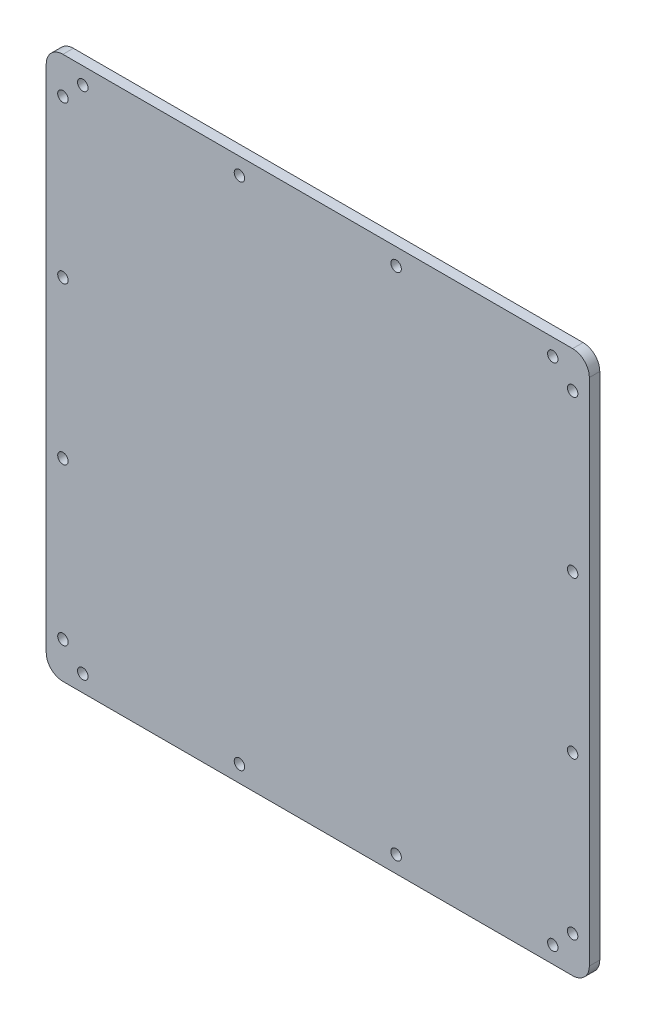
ISO-10303-21;
HEADER;
FILE_DESCRIPTION(('STEP AP214'),'2;1');
FILE_NAME('part.step','',(''),(''),'','','');
FILE_SCHEMA(('AUTOMOTIVE_DESIGN { 1 0 10303 214 1 1 1 1 }'));
ENDSEC;
DATA;
#1=APPLICATION_CONTEXT('core data for automotive mechanical design processes');
#2=APPLICATION_PROTOCOL_DEFINITION('international standard','automotive_design',2000,#1);
#3=PRODUCT_CONTEXT('',#1,'mechanical');
#4=PRODUCT('Part','Part','',(#3));
#5=PRODUCT_RELATED_PRODUCT_CATEGORY('part','',(#4));
#6=PRODUCT_DEFINITION_FORMATION('','',#4);
#7=PRODUCT_DEFINITION_CONTEXT('part definition',#1,'design');
#8=PRODUCT_DEFINITION('design','',#6,#7);
#9=PRODUCT_DEFINITION_SHAPE('','',#8);
#10=(LENGTH_UNIT() NAMED_UNIT(*) SI_UNIT(.MILLI.,.METRE.));
#11=(NAMED_UNIT(*) PLANE_ANGLE_UNIT() SI_UNIT($,.RADIAN.));
#12=(NAMED_UNIT(*) SI_UNIT($,.STERADIAN.) SOLID_ANGLE_UNIT());
#13=UNCERTAINTY_MEASURE_WITH_UNIT(LENGTH_MEASURE(1.E-05),#10,'distance_accuracy_value','');
#14=(GEOMETRIC_REPRESENTATION_CONTEXT(3) GLOBAL_UNCERTAINTY_ASSIGNED_CONTEXT((#13)) GLOBAL_UNIT_ASSIGNED_CONTEXT((#10,
#11,#12)) REPRESENTATION_CONTEXT('',''));
#15=CARTESIAN_POINT('',(0.,0.,0.));
#16=DIRECTION('',(0.,0.,1.));
#17=DIRECTION('',(1.,0.,0.));
#18=AXIS2_PLACEMENT_3D('',#15,#16,#17);
#19=CARTESIAN_POINT('',(8.,8.00000000000001,5.));
#20=DIRECTION('',(0.,0.,-1.));
#21=DIRECTION('',(-1.,0.,0.));
#22=AXIS2_PLACEMENT_3D('',#19,#20,#21);
#23=PLANE('',#22);
#24=CARTESIAN_POINT('',(8.,8.00000000000001,5.));
#25=DIRECTION('',(0.,0.,1.));
#26=DIRECTION('',(-1.,0.,0.));
#27=AXIS2_PLACEMENT_3D('',#24,#25,#26);
#28=CIRCLE('',#27,8.);
#29=CARTESIAN_POINT('',(0.,8.00000000000001,5.));
#30=VERTEX_POINT('',#29);
#31=CARTESIAN_POINT('',(8.,0.,5.));
#32=VERTEX_POINT('',#31);
#33=EDGE_CURVE('E145',#30,#32,#28,.T.);
#34=ORIENTED_EDGE('',*,*,#33,.T.);
#35=DIRECTION('',(1.,0.,0.));
#36=VECTOR('',#35,1.);
#37=CARTESIAN_POINT('',(8.,0.,5.));
#38=LINE('',#37,#36);
#39=CARTESIAN_POINT('',(252.,0.,5.));
#40=VERTEX_POINT('',#39);
#41=EDGE_CURVE('E93',#32,#40,#38,.T.);
#42=ORIENTED_EDGE('',*,*,#41,.T.);
#43=CARTESIAN_POINT('',(252.,8.00000000000001,5.));
#44=DIRECTION('',(0.,0.,1.));
#45=DIRECTION('',(1.,0.,0.));
#46=AXIS2_PLACEMENT_3D('',#43,#44,#45);
#47=CIRCLE('',#46,8.00000000000001);
#48=CARTESIAN_POINT('',(260.,8.00000000000001,5.));
#49=VERTEX_POINT('',#48);
#50=EDGE_CURVE('E160',#40,#49,#47,.T.);
#51=ORIENTED_EDGE('',*,*,#50,.T.);
#52=DIRECTION('',(0.,1.,0.));
#53=VECTOR('',#52,1.);
#54=CARTESIAN_POINT('',(260.,252.,5.));
#55=LINE('',#54,#53);
#56=CARTESIAN_POINT('',(260.,252.,5.));
#57=VERTEX_POINT('',#56);
#58=EDGE_CURVE('E173',#49,#57,#55,.T.);
#59=ORIENTED_EDGE('',*,*,#58,.T.);
#60=CARTESIAN_POINT('',(252.,252.,5.));
#61=DIRECTION('',(0.,0.,1.));
#62=DIRECTION('',(1.,0.,0.));
#63=AXIS2_PLACEMENT_3D('',#60,#61,#62);
#64=CIRCLE('',#63,8.00000000000001);
#65=CARTESIAN_POINT('',(252.,260.,5.));
#66=VERTEX_POINT('',#65);
#67=EDGE_CURVE('E112',#57,#66,#64,.T.);
#68=ORIENTED_EDGE('',*,*,#67,.T.);
#69=DIRECTION('',(-1.,0.,0.));
#70=VECTOR('',#69,1.);
#71=CARTESIAN_POINT('',(8.,260.,5.));
#72=LINE('',#71,#70);
#73=CARTESIAN_POINT('',(8.,260.,5.));
#74=VERTEX_POINT('',#73);
#75=EDGE_CURVE('E106',#66,#74,#72,.T.);
#76=ORIENTED_EDGE('',*,*,#75,.T.);
#77=CARTESIAN_POINT('',(8.00000000000001,252.,5.));
#78=DIRECTION('',(0.,0.,1.));
#79=DIRECTION('',(-1.,0.,0.));
#80=AXIS2_PLACEMENT_3D('',#77,#78,#79);
#81=CIRCLE('',#80,8.00000000000001);
#82=CARTESIAN_POINT('',(0.,252.,5.));
#83=VERTEX_POINT('',#82);
#84=EDGE_CURVE('E110',#74,#83,#81,.T.);
#85=ORIENTED_EDGE('',*,*,#84,.T.);
#86=DIRECTION('',(0.,-1.,0.));
#87=VECTOR('',#86,1.);
#88=CARTESIAN_POINT('',(0.,252.,5.));
#89=LINE('',#88,#87);
#90=EDGE_CURVE('E50',#83,#30,#89,.T.);
#91=ORIENTED_EDGE('',*,*,#90,.T.);
#92=EDGE_LOOP('',(#34,#42,#51,#59,#68,#76,#85,#91));
#93=FACE_BOUND('',#92,.T.);
#94=CARTESIAN_POINT('',(17.5,8.,5.));
#95=DIRECTION('',(0.,0.,1.));
#96=DIRECTION('',(1.,0.,0.));
#97=AXIS2_PLACEMENT_3D('',#94,#95,#96);
#98=CIRCLE('',#97,2.5);
#99=CARTESIAN_POINT('',(20.,8.,5.));
#100=VERTEX_POINT('',#99);
#101=EDGE_CURVE('E134',#100,#100,#98,.T.);
#102=ORIENTED_EDGE('',*,*,#101,.F.);
#103=EDGE_LOOP('',(#102));
#104=FACE_BOUND('',#103,.T.);
#105=CARTESIAN_POINT('',(92.5,8.,5.));
#106=DIRECTION('',(0.,0.,1.));
#107=DIRECTION('',(1.,0.,0.));
#108=AXIS2_PLACEMENT_3D('',#105,#106,#107);
#109=CIRCLE('',#108,2.49999999999999);
#110=CARTESIAN_POINT('',(95.,8.,5.));
#111=VERTEX_POINT('',#110);
#112=EDGE_CURVE('E182',#111,#111,#109,.T.);
#113=ORIENTED_EDGE('',*,*,#112,.F.);
#114=EDGE_LOOP('',(#113));
#115=FACE_BOUND('',#114,.T.);
#116=CARTESIAN_POINT('',(167.5,8.,5.));
#117=DIRECTION('',(0.,0.,1.));
#118=DIRECTION('',(1.,0.,0.));
#119=AXIS2_PLACEMENT_3D('',#116,#117,#118);
#120=CIRCLE('',#119,2.5);
#121=CARTESIAN_POINT('',(170.,8.,5.));
#122=VERTEX_POINT('',#121);
#123=EDGE_CURVE('E188',#122,#122,#120,.T.);
#124=ORIENTED_EDGE('',*,*,#123,.F.);
#125=EDGE_LOOP('',(#124));
#126=FACE_BOUND('',#125,.T.);
#127=CARTESIAN_POINT('',(242.5,8.,5.));
#128=DIRECTION('',(0.,0.,1.));
#129=DIRECTION('',(1.,0.,0.));
#130=AXIS2_PLACEMENT_3D('',#127,#128,#129);
#131=CIRCLE('',#130,2.50000000000002);
#132=CARTESIAN_POINT('',(245.,8.,5.));
#133=VERTEX_POINT('',#132);
#134=EDGE_CURVE('E194',#133,#133,#131,.T.);
#135=ORIENTED_EDGE('',*,*,#134,.F.);
#136=EDGE_LOOP('',(#135));
#137=FACE_BOUND('',#136,.T.);
#138=CARTESIAN_POINT('',(252.,242.5,5.));
#139=DIRECTION('',(0.,0.,1.));
#140=DIRECTION('',(1.,0.,0.));
#141=AXIS2_PLACEMENT_3D('',#138,#139,#140);
#142=CIRCLE('',#141,2.50000000000002);
#143=CARTESIAN_POINT('',(254.5,242.5,5.));
#144=VERTEX_POINT('',#143);
#145=EDGE_CURVE('E200',#144,#144,#142,.T.);
#146=ORIENTED_EDGE('',*,*,#145,.F.);
#147=EDGE_LOOP('',(#146));
#148=FACE_BOUND('',#147,.T.);
#149=CARTESIAN_POINT('',(252.000000000003,167.5,5.));
#150=DIRECTION('',(0.,0.,1.));
#151=DIRECTION('',(1.,0.,0.));
#152=AXIS2_PLACEMENT_3D('',#149,#150,#151);
#153=CIRCLE('',#152,2.49999999999833);
#154=CARTESIAN_POINT('',(254.500000000001,167.5,5.));
#155=VERTEX_POINT('',#154);
#156=EDGE_CURVE('E206',#155,#155,#153,.T.);
#157=ORIENTED_EDGE('',*,*,#156,.F.);
#158=EDGE_LOOP('',(#157));
#159=FACE_BOUND('',#158,.T.);
#160=CARTESIAN_POINT('',(252.000000000003,92.5,5.));
#161=DIRECTION('',(0.,0.,1.));
#162=DIRECTION('',(1.,0.,0.));
#163=AXIS2_PLACEMENT_3D('',#160,#161,#162);
#164=CIRCLE('',#163,2.49999999999808);
#165=CARTESIAN_POINT('',(254.500000000001,92.5,5.));
#166=VERTEX_POINT('',#165);
#167=EDGE_CURVE('E212',#166,#166,#164,.T.);
#168=ORIENTED_EDGE('',*,*,#167,.F.);
#169=EDGE_LOOP('',(#168));
#170=FACE_BOUND('',#169,.T.);
#171=CARTESIAN_POINT('',(252.000000000002,17.5,5.));
#172=DIRECTION('',(0.,0.,1.));
#173=DIRECTION('',(1.,0.,0.));
#174=AXIS2_PLACEMENT_3D('',#171,#172,#173);
#175=CIRCLE('',#174,2.50000000000002);
#176=CARTESIAN_POINT('',(254.500000000002,17.5,5.));
#177=VERTEX_POINT('',#176);
#178=EDGE_CURVE('E218',#177,#177,#175,.T.);
#179=ORIENTED_EDGE('',*,*,#178,.F.);
#180=EDGE_LOOP('',(#179));
#181=FACE_BOUND('',#180,.T.);
#182=CARTESIAN_POINT('',(242.5,252.,5.));
#183=DIRECTION('',(0.,0.,1.));
#184=DIRECTION('',(-1.,0.,0.));
#185=AXIS2_PLACEMENT_3D('',#182,#183,#184);
#186=CIRCLE('',#185,2.50000000000002);
#187=CARTESIAN_POINT('',(240.,252.,5.));
#188=VERTEX_POINT('',#187);
#189=EDGE_CURVE('E224',#188,#188,#186,.T.);
#190=ORIENTED_EDGE('',*,*,#189,.F.);
#191=EDGE_LOOP('',(#190));
#192=FACE_BOUND('',#191,.T.);
#193=CARTESIAN_POINT('',(167.5,252.,5.));
#194=DIRECTION('',(0.,0.,1.));
#195=DIRECTION('',(-1.,0.,0.));
#196=AXIS2_PLACEMENT_3D('',#193,#194,#195);
#197=CIRCLE('',#196,2.5);
#198=CARTESIAN_POINT('',(165.,252.,5.));
#199=VERTEX_POINT('',#198);
#200=EDGE_CURVE('E230',#199,#199,#197,.T.);
#201=ORIENTED_EDGE('',*,*,#200,.F.);
#202=EDGE_LOOP('',(#201));
#203=FACE_BOUND('',#202,.T.);
#204=CARTESIAN_POINT('',(92.5,252.,5.));
#205=DIRECTION('',(0.,0.,1.));
#206=DIRECTION('',(-1.,0.,0.));
#207=AXIS2_PLACEMENT_3D('',#204,#205,#206);
#208=CIRCLE('',#207,2.50000000000001);
#209=CARTESIAN_POINT('',(90.,252.,5.));
#210=VERTEX_POINT('',#209);
#211=EDGE_CURVE('E236',#210,#210,#208,.T.);
#212=ORIENTED_EDGE('',*,*,#211,.F.);
#213=EDGE_LOOP('',(#212));
#214=FACE_BOUND('',#213,.T.);
#215=CARTESIAN_POINT('',(17.5,252.,5.));
#216=DIRECTION('',(0.,0.,1.));
#217=DIRECTION('',(-1.,0.,0.));
#218=AXIS2_PLACEMENT_3D('',#215,#216,#217);
#219=CIRCLE('',#218,2.5);
#220=CARTESIAN_POINT('',(15.,252.,5.));
#221=VERTEX_POINT('',#220);
#222=EDGE_CURVE('E242',#221,#221,#219,.T.);
#223=ORIENTED_EDGE('',*,*,#222,.F.);
#224=EDGE_LOOP('',(#223));
#225=FACE_BOUND('',#224,.T.);
#226=CARTESIAN_POINT('',(7.99999999999768,17.5,5.));
#227=DIRECTION('',(0.,0.,1.));
#228=DIRECTION('',(-1.,0.,0.));
#229=AXIS2_PLACEMENT_3D('',#226,#227,#228);
#230=CIRCLE('',#229,2.50000000000002);
#231=CARTESIAN_POINT('',(5.49999999999766,17.5,5.));
#232=VERTEX_POINT('',#231);
#233=EDGE_CURVE('E248',#232,#232,#230,.T.);
#234=ORIENTED_EDGE('',*,*,#233,.F.);
#235=EDGE_LOOP('',(#234));
#236=FACE_BOUND('',#235,.T.);
#237=CARTESIAN_POINT('',(7.99999999999845,92.5,5.));
#238=DIRECTION('',(0.,0.,1.));
#239=DIRECTION('',(-1.,0.,0.));
#240=AXIS2_PLACEMENT_3D('',#237,#238,#239);
#241=CIRCLE('',#240,2.49999999999907);
#242=CARTESIAN_POINT('',(5.49999999999939,92.5,5.));
#243=VERTEX_POINT('',#242);
#244=EDGE_CURVE('E254',#243,#243,#241,.T.);
#245=ORIENTED_EDGE('',*,*,#244,.F.);
#246=EDGE_LOOP('',(#245));
#247=FACE_BOUND('',#246,.T.);
#248=CARTESIAN_POINT('',(7.99999999999923,167.5,5.));
#249=DIRECTION('',(0.,0.,1.));
#250=DIRECTION('',(-1.,0.,0.));
#251=AXIS2_PLACEMENT_3D('',#248,#249,#250);
#252=CIRCLE('',#251,2.5);
#253=CARTESIAN_POINT('',(5.49999999999923,167.5,5.));
#254=VERTEX_POINT('',#253);
#255=EDGE_CURVE('E260',#254,#254,#252,.T.);
#256=ORIENTED_EDGE('',*,*,#255,.F.);
#257=EDGE_LOOP('',(#256));
#258=FACE_BOUND('',#257,.T.);
#259=CARTESIAN_POINT('',(8.00000000000001,242.5,5.));
#260=DIRECTION('',(0.,0.,1.));
#261=DIRECTION('',(-1.,0.,0.));
#262=AXIS2_PLACEMENT_3D('',#259,#260,#261);
#263=CIRCLE('',#262,2.5);
#264=CARTESIAN_POINT('',(5.50000000000001,242.5,5.));
#265=VERTEX_POINT('',#264);
#266=EDGE_CURVE('E266',#265,#265,#263,.T.);
#267=ORIENTED_EDGE('',*,*,#266,.F.);
#268=EDGE_LOOP('',(#267));
#269=FACE_BOUND('',#268,.T.);
#270=ADVANCED_FACE('F33',(#93,#104,#115,#126,#137,#148,#159,#170,#181,#192,#203,#214,#225,#236,
#247,#258,#269),#23,.F.);
#271=CARTESIAN_POINT('',(8.,8.00000000000001,0.));
#272=DIRECTION('',(0.,0.,-1.));
#273=DIRECTION('',(-1.,0.,0.));
#274=AXIS2_PLACEMENT_3D('',#271,#272,#273);
#275=PLANE('',#274);
#276=CARTESIAN_POINT('',(7.99999999999923,167.5,0.));
#277=DIRECTION('',(0.,0.,1.));
#278=DIRECTION('',(-1.,0.,0.));
#279=AXIS2_PLACEMENT_3D('',#276,#277,#278);
#280=CIRCLE('',#279,2.5);
#281=CARTESIAN_POINT('',(5.49999999999923,167.5,0.));
#282=VERTEX_POINT('',#281);
#283=EDGE_CURVE('E263',#282,#282,#280,.T.);
#284=ORIENTED_EDGE('',*,*,#283,.T.);
#285=EDGE_LOOP('',(#284));
#286=FACE_BOUND('',#285,.T.);
#287=CARTESIAN_POINT('',(7.99999999999768,17.5,0.));
#288=DIRECTION('',(0.,0.,1.));
#289=DIRECTION('',(-1.,0.,0.));
#290=AXIS2_PLACEMENT_3D('',#287,#288,#289);
#291=CIRCLE('',#290,2.50000000000002);
#292=CARTESIAN_POINT('',(5.49999999999766,17.5,0.));
#293=VERTEX_POINT('',#292);
#294=EDGE_CURVE('E251',#293,#293,#291,.T.);
#295=ORIENTED_EDGE('',*,*,#294,.T.);
#296=EDGE_LOOP('',(#295));
#297=FACE_BOUND('',#296,.T.);
#298=CARTESIAN_POINT('',(92.5,252.,0.));
#299=DIRECTION('',(0.,0.,1.));
#300=DIRECTION('',(-1.,0.,0.));
#301=AXIS2_PLACEMENT_3D('',#298,#299,#300);
#302=CIRCLE('',#301,2.50000000000001);
#303=CARTESIAN_POINT('',(90.,252.,0.));
#304=VERTEX_POINT('',#303);
#305=EDGE_CURVE('E239',#304,#304,#302,.T.);
#306=ORIENTED_EDGE('',*,*,#305,.T.);
#307=EDGE_LOOP('',(#306));
#308=FACE_BOUND('',#307,.T.);
#309=CARTESIAN_POINT('',(242.5,252.,0.));
#310=DIRECTION('',(0.,0.,1.));
#311=DIRECTION('',(-1.,0.,0.));
#312=AXIS2_PLACEMENT_3D('',#309,#310,#311);
#313=CIRCLE('',#312,2.50000000000002);
#314=CARTESIAN_POINT('',(240.,252.,0.));
#315=VERTEX_POINT('',#314);
#316=EDGE_CURVE('E227',#315,#315,#313,.T.);
#317=ORIENTED_EDGE('',*,*,#316,.T.);
#318=EDGE_LOOP('',(#317));
#319=FACE_BOUND('',#318,.T.);
#320=CARTESIAN_POINT('',(252.000000000003,92.5,0.));
#321=DIRECTION('',(0.,0.,1.));
#322=DIRECTION('',(1.,0.,0.));
#323=AXIS2_PLACEMENT_3D('',#320,#321,#322);
#324=CIRCLE('',#323,2.49999999999808);
#325=CARTESIAN_POINT('',(254.500000000001,92.5,0.));
#326=VERTEX_POINT('',#325);
#327=EDGE_CURVE('E215',#326,#326,#324,.T.);
#328=ORIENTED_EDGE('',*,*,#327,.T.);
#329=EDGE_LOOP('',(#328));
#330=FACE_BOUND('',#329,.T.);
#331=CARTESIAN_POINT('',(252.,242.5,0.));
#332=DIRECTION('',(0.,0.,1.));
#333=DIRECTION('',(1.,0.,0.));
#334=AXIS2_PLACEMENT_3D('',#331,#332,#333);
#335=CIRCLE('',#334,2.50000000000002);
#336=CARTESIAN_POINT('',(254.5,242.5,0.));
#337=VERTEX_POINT('',#336);
#338=EDGE_CURVE('E203',#337,#337,#335,.T.);
#339=ORIENTED_EDGE('',*,*,#338,.T.);
#340=EDGE_LOOP('',(#339));
#341=FACE_BOUND('',#340,.T.);
#342=CARTESIAN_POINT('',(167.5,8.,0.));
#343=DIRECTION('',(0.,0.,1.));
#344=DIRECTION('',(1.,0.,0.));
#345=AXIS2_PLACEMENT_3D('',#342,#343,#344);
#346=CIRCLE('',#345,2.5);
#347=CARTESIAN_POINT('',(170.,8.,0.));
#348=VERTEX_POINT('',#347);
#349=EDGE_CURVE('E191',#348,#348,#346,.T.);
#350=ORIENTED_EDGE('',*,*,#349,.T.);
#351=EDGE_LOOP('',(#350));
#352=FACE_BOUND('',#351,.T.);
#353=CARTESIAN_POINT('',(17.5,8.,0.));
#354=DIRECTION('',(0.,0.,1.));
#355=DIRECTION('',(1.,0.,0.));
#356=AXIS2_PLACEMENT_3D('',#353,#354,#355);
#357=CIRCLE('',#356,2.5);
#358=CARTESIAN_POINT('',(20.,8.,0.));
#359=VERTEX_POINT('',#358);
#360=EDGE_CURVE('E179',#359,#359,#357,.T.);
#361=ORIENTED_EDGE('',*,*,#360,.T.);
#362=EDGE_LOOP('',(#361));
#363=FACE_BOUND('',#362,.T.);
#364=CARTESIAN_POINT('',(8.,8.00000000000001,0.));
#365=DIRECTION('',(0.,0.,1.));
#366=DIRECTION('',(-1.,0.,0.));
#367=AXIS2_PLACEMENT_3D('',#364,#365,#366);
#368=CIRCLE('',#367,8.);
#369=CARTESIAN_POINT('',(0.,8.00000000000001,0.));
#370=VERTEX_POINT('',#369);
#371=CARTESIAN_POINT('',(8.,0.,0.));
#372=VERTEX_POINT('',#371);
#373=EDGE_CURVE('E130',#370,#372,#368,.T.);
#374=ORIENTED_EDGE('',*,*,#373,.F.);
#375=DIRECTION('',(0.,-1.,0.));
#376=VECTOR('',#375,1.);
#377=CARTESIAN_POINT('',(0.,252.,0.));
#378=LINE('',#377,#376);
#379=CARTESIAN_POINT('',(0.,252.,0.));
#380=VERTEX_POINT('',#379);
#381=EDGE_CURVE('E85',#380,#370,#378,.T.);
#382=ORIENTED_EDGE('',*,*,#381,.F.);
#383=CARTESIAN_POINT('',(8.00000000000001,252.,0.));
#384=DIRECTION('',(0.,0.,1.));
#385=DIRECTION('',(-1.,0.,0.));
#386=AXIS2_PLACEMENT_3D('',#383,#384,#385);
#387=CIRCLE('',#386,8.00000000000001);
#388=CARTESIAN_POINT('',(8.,260.,0.));
#389=VERTEX_POINT('',#388);
#390=EDGE_CURVE('E79',#389,#380,#387,.T.);
#391=ORIENTED_EDGE('',*,*,#390,.F.);
#392=DIRECTION('',(-1.,0.,0.));
#393=VECTOR('',#392,1.);
#394=CARTESIAN_POINT('',(8.,260.,0.));
#395=LINE('',#394,#393);
#396=CARTESIAN_POINT('',(252.,260.,0.));
#397=VERTEX_POINT('',#396);
#398=EDGE_CURVE('E120',#397,#389,#395,.T.);
#399=ORIENTED_EDGE('',*,*,#398,.F.);
#400=CARTESIAN_POINT('',(252.,252.,0.));
#401=DIRECTION('',(0.,0.,1.));
#402=DIRECTION('',(1.,0.,0.));
#403=AXIS2_PLACEMENT_3D('',#400,#401,#402);
#404=CIRCLE('',#403,8.00000000000001);
#405=CARTESIAN_POINT('',(260.,252.,0.));
#406=VERTEX_POINT('',#405);
#407=EDGE_CURVE('E140',#406,#397,#404,.T.);
#408=ORIENTED_EDGE('',*,*,#407,.F.);
#409=DIRECTION('',(0.,1.,0.));
#410=VECTOR('',#409,1.);
#411=CARTESIAN_POINT('',(260.,252.,0.));
#412=LINE('',#411,#410);
#413=CARTESIAN_POINT('',(260.,8.00000000000001,0.));
#414=VERTEX_POINT('',#413);
#415=EDGE_CURVE('E138',#414,#406,#412,.T.);
#416=ORIENTED_EDGE('',*,*,#415,.F.);
#417=CARTESIAN_POINT('',(252.,8.00000000000001,0.));
#418=DIRECTION('',(0.,0.,1.));
#419=DIRECTION('',(1.,0.,0.));
#420=AXIS2_PLACEMENT_3D('',#417,#418,#419);
#421=CIRCLE('',#420,8.00000000000001);
#422=CARTESIAN_POINT('',(252.,0.,0.));
#423=VERTEX_POINT('',#422);
#424=EDGE_CURVE('E136',#423,#414,#421,.T.);
#425=ORIENTED_EDGE('',*,*,#424,.F.);
#426=DIRECTION('',(1.,0.,0.));
#427=VECTOR('',#426,1.);
#428=CARTESIAN_POINT('',(8.,0.,0.));
#429=LINE('',#428,#427);
#430=EDGE_CURVE('E133',#372,#423,#429,.T.);
#431=ORIENTED_EDGE('',*,*,#430,.F.);
#432=EDGE_LOOP('',(#374,#382,#391,#399,#408,#416,#425,#431));
#433=FACE_BOUND('',#432,.T.);
#434=CARTESIAN_POINT('',(92.5,8.,0.));
#435=DIRECTION('',(0.,0.,1.));
#436=DIRECTION('',(1.,0.,0.));
#437=AXIS2_PLACEMENT_3D('',#434,#435,#436);
#438=CIRCLE('',#437,2.49999999999999);
#439=CARTESIAN_POINT('',(95.,8.,0.));
#440=VERTEX_POINT('',#439);
#441=EDGE_CURVE('E185',#440,#440,#438,.T.);
#442=ORIENTED_EDGE('',*,*,#441,.T.);
#443=EDGE_LOOP('',(#442));
#444=FACE_BOUND('',#443,.T.);
#445=CARTESIAN_POINT('',(242.5,8.,0.));
#446=DIRECTION('',(0.,0.,1.));
#447=DIRECTION('',(1.,0.,0.));
#448=AXIS2_PLACEMENT_3D('',#445,#446,#447);
#449=CIRCLE('',#448,2.50000000000002);
#450=CARTESIAN_POINT('',(245.,8.,0.));
#451=VERTEX_POINT('',#450);
#452=EDGE_CURVE('E197',#451,#451,#449,.T.);
#453=ORIENTED_EDGE('',*,*,#452,.T.);
#454=EDGE_LOOP('',(#453));
#455=FACE_BOUND('',#454,.T.);
#456=CARTESIAN_POINT('',(252.000000000003,167.5,0.));
#457=DIRECTION('',(0.,0.,1.));
#458=DIRECTION('',(1.,0.,0.));
#459=AXIS2_PLACEMENT_3D('',#456,#457,#458);
#460=CIRCLE('',#459,2.49999999999833);
#461=CARTESIAN_POINT('',(254.500000000001,167.5,0.));
#462=VERTEX_POINT('',#461);
#463=EDGE_CURVE('E209',#462,#462,#460,.T.);
#464=ORIENTED_EDGE('',*,*,#463,.T.);
#465=EDGE_LOOP('',(#464));
#466=FACE_BOUND('',#465,.T.);
#467=CARTESIAN_POINT('',(252.000000000002,17.5,0.));
#468=DIRECTION('',(0.,0.,1.));
#469=DIRECTION('',(1.,0.,0.));
#470=AXIS2_PLACEMENT_3D('',#467,#468,#469);
#471=CIRCLE('',#470,2.50000000000002);
#472=CARTESIAN_POINT('',(254.500000000002,17.5,0.));
#473=VERTEX_POINT('',#472);
#474=EDGE_CURVE('E221',#473,#473,#471,.T.);
#475=ORIENTED_EDGE('',*,*,#474,.T.);
#476=EDGE_LOOP('',(#475));
#477=FACE_BOUND('',#476,.T.);
#478=CARTESIAN_POINT('',(167.5,252.,0.));
#479=DIRECTION('',(0.,0.,1.));
#480=DIRECTION('',(-1.,0.,0.));
#481=AXIS2_PLACEMENT_3D('',#478,#479,#480);
#482=CIRCLE('',#481,2.5);
#483=CARTESIAN_POINT('',(165.,252.,0.));
#484=VERTEX_POINT('',#483);
#485=EDGE_CURVE('E233',#484,#484,#482,.T.);
#486=ORIENTED_EDGE('',*,*,#485,.T.);
#487=EDGE_LOOP('',(#486));
#488=FACE_BOUND('',#487,.T.);
#489=CARTESIAN_POINT('',(17.5,252.,0.));
#490=DIRECTION('',(0.,0.,1.));
#491=DIRECTION('',(-1.,0.,0.));
#492=AXIS2_PLACEMENT_3D('',#489,#490,#491);
#493=CIRCLE('',#492,2.5);
#494=CARTESIAN_POINT('',(15.,252.,0.));
#495=VERTEX_POINT('',#494);
#496=EDGE_CURVE('E245',#495,#495,#493,.T.);
#497=ORIENTED_EDGE('',*,*,#496,.T.);
#498=EDGE_LOOP('',(#497));
#499=FACE_BOUND('',#498,.T.);
#500=CARTESIAN_POINT('',(7.99999999999845,92.5,0.));
#501=DIRECTION('',(0.,0.,1.));
#502=DIRECTION('',(-1.,0.,0.));
#503=AXIS2_PLACEMENT_3D('',#500,#501,#502);
#504=CIRCLE('',#503,2.49999999999907);
#505=CARTESIAN_POINT('',(5.49999999999939,92.5,0.));
#506=VERTEX_POINT('',#505);
#507=EDGE_CURVE('E257',#506,#506,#504,.T.);
#508=ORIENTED_EDGE('',*,*,#507,.T.);
#509=EDGE_LOOP('',(#508));
#510=FACE_BOUND('',#509,.T.);
#511=CARTESIAN_POINT('',(8.00000000000001,242.5,0.));
#512=DIRECTION('',(0.,0.,1.));
#513=DIRECTION('',(-1.,0.,0.));
#514=AXIS2_PLACEMENT_3D('',#511,#512,#513);
#515=CIRCLE('',#514,2.5);
#516=CARTESIAN_POINT('',(5.50000000000001,242.5,0.));
#517=VERTEX_POINT('',#516);
#518=EDGE_CURVE('E269',#517,#517,#515,.T.);
#519=ORIENTED_EDGE('',*,*,#518,.T.);
#520=EDGE_LOOP('',(#519));
#521=FACE_BOUND('',#520,.T.);
#522=ADVANCED_FACE('F164',(#286,#297,#308,#319,#330,#341,#352,#363,#433,#444,#455,#466,#477,
#488,#499,#510,#521),#275,.T.);
#523=CARTESIAN_POINT('',(8.,8.00000000000001,5.));
#524=DIRECTION('',(0.,0.,-1.));
#525=DIRECTION('',(-1.,0.,0.));
#526=AXIS2_PLACEMENT_3D('',#523,#524,#525);
#527=CYLINDRICAL_SURFACE('',#526,8.);
#528=ORIENTED_EDGE('',*,*,#373,.T.);
#529=DIRECTION('',(0.,0.,-1.));
#530=VECTOR('',#529,1.);
#531=CARTESIAN_POINT('',(8.,0.,5.));
#532=LINE('',#531,#530);
#533=EDGE_CURVE('E11',#32,#372,#532,.T.);
#534=ORIENTED_EDGE('',*,*,#533,.F.);
#535=ORIENTED_EDGE('',*,*,#33,.F.);
#536=DIRECTION('',(0.,0.,-1.));
#537=VECTOR('',#536,1.);
#538=CARTESIAN_POINT('',(0.,8.00000000000001,5.));
#539=LINE('',#538,#537);
#540=EDGE_CURVE('E126',#30,#370,#539,.T.);
#541=ORIENTED_EDGE('',*,*,#540,.T.);
#542=EDGE_LOOP('',(#528,#534,#535,#541));
#543=FACE_BOUND('',#542,.T.);
#544=ADVANCED_FACE('F35',(#543),#527,.T.);
#545=CARTESIAN_POINT('',(8.,0.,5.));
#546=DIRECTION('',(0.,1.,0.));
#547=DIRECTION('',(0.,0.,1.));
#548=AXIS2_PLACEMENT_3D('',#545,#546,#547);
#549=PLANE('',#548);
#550=ORIENTED_EDGE('',*,*,#430,.T.);
#551=DIRECTION('',(0.,0.,-1.));
#552=VECTOR('',#551,1.);
#553=CARTESIAN_POINT('',(252.,0.,5.));
#554=LINE('',#553,#552);
#555=EDGE_CURVE('E42',#40,#423,#554,.T.);
#556=ORIENTED_EDGE('',*,*,#555,.F.);
#557=ORIENTED_EDGE('',*,*,#41,.F.);
#558=ORIENTED_EDGE('',*,*,#533,.T.);
#559=EDGE_LOOP('',(#550,#556,#557,#558));
#560=FACE_BOUND('',#559,.T.);
#561=ADVANCED_FACE('F301',(#560),#549,.F.);
#562=CARTESIAN_POINT('',(252.,8.00000000000001,5.));
#563=DIRECTION('',(0.,0.,-1.));
#564=DIRECTION('',(-1.,0.,0.));
#565=AXIS2_PLACEMENT_3D('',#562,#563,#564);
#566=CYLINDRICAL_SURFACE('',#565,8.00000000000001);
#567=ORIENTED_EDGE('',*,*,#424,.T.);
#568=DIRECTION('',(0.,0.,-1.));
#569=VECTOR('',#568,1.);
#570=CARTESIAN_POINT('',(260.,8.00000000000001,5.));
#571=LINE('',#570,#569);
#572=EDGE_CURVE('E152',#49,#414,#571,.T.);
#573=ORIENTED_EDGE('',*,*,#572,.F.);
#574=ORIENTED_EDGE('',*,*,#50,.F.);
#575=ORIENTED_EDGE('',*,*,#555,.T.);
#576=EDGE_LOOP('',(#567,#573,#574,#575));
#577=FACE_BOUND('',#576,.T.);
#578=ADVANCED_FACE('F158',(#577),#566,.T.);
#579=CARTESIAN_POINT('',(260.,252.,5.));
#580=DIRECTION('',(-1.,0.,0.));
#581=DIRECTION('',(0.,0.,1.));
#582=AXIS2_PLACEMENT_3D('',#579,#580,#581);
#583=PLANE('',#582);
#584=ORIENTED_EDGE('',*,*,#415,.T.);
#585=DIRECTION('',(0.,0.,-1.));
#586=VECTOR('',#585,1.);
#587=CARTESIAN_POINT('',(260.,252.,5.));
#588=LINE('',#587,#586);
#589=EDGE_CURVE('E149',#57,#406,#588,.T.);
#590=ORIENTED_EDGE('',*,*,#589,.F.);
#591=ORIENTED_EDGE('',*,*,#58,.F.);
#592=ORIENTED_EDGE('',*,*,#572,.T.);
#593=EDGE_LOOP('',(#584,#590,#591,#592));
#594=FACE_BOUND('',#593,.T.);
#595=ADVANCED_FACE('F169',(#594),#583,.F.);
#596=CARTESIAN_POINT('',(252.,252.,5.));
#597=DIRECTION('',(0.,0.,-1.));
#598=DIRECTION('',(-1.,0.,0.));
#599=AXIS2_PLACEMENT_3D('',#596,#597,#598);
#600=CYLINDRICAL_SURFACE('',#599,8.00000000000001);
#601=ORIENTED_EDGE('',*,*,#407,.T.);
#602=DIRECTION('',(0.,0.,-1.));
#603=VECTOR('',#602,1.);
#604=CARTESIAN_POINT('',(252.,260.,5.));
#605=LINE('',#604,#603);
#606=EDGE_CURVE('E121',#66,#397,#605,.T.);
#607=ORIENTED_EDGE('',*,*,#606,.F.);
#608=ORIENTED_EDGE('',*,*,#67,.F.);
#609=ORIENTED_EDGE('',*,*,#589,.T.);
#610=EDGE_LOOP('',(#601,#607,#608,#609));
#611=FACE_BOUND('',#610,.T.);
#612=ADVANCED_FACE('F172',(#611),#600,.T.);
#613=CARTESIAN_POINT('',(8.,260.,5.));
#614=DIRECTION('',(0.,-1.,0.));
#615=DIRECTION('',(0.,0.,-1.));
#616=AXIS2_PLACEMENT_3D('',#613,#614,#615);
#617=PLANE('',#616);
#618=ORIENTED_EDGE('',*,*,#398,.T.);
#619=DIRECTION('',(0.,0.,-1.));
#620=VECTOR('',#619,1.);
#621=CARTESIAN_POINT('',(8.,260.,5.));
#622=LINE('',#621,#620);
#623=EDGE_CURVE('E117',#74,#389,#622,.T.);
#624=ORIENTED_EDGE('',*,*,#623,.F.);
#625=ORIENTED_EDGE('',*,*,#75,.F.);
#626=ORIENTED_EDGE('',*,*,#606,.T.);
#627=EDGE_LOOP('',(#618,#624,#625,#626));
#628=FACE_BOUND('',#627,.T.);
#629=ADVANCED_FACE('F118',(#628),#617,.F.);
#630=CARTESIAN_POINT('',(8.00000000000001,252.,5.));
#631=DIRECTION('',(0.,0.,-1.));
#632=DIRECTION('',(-1.,0.,0.));
#633=AXIS2_PLACEMENT_3D('',#630,#631,#632);
#634=CYLINDRICAL_SURFACE('',#633,8.00000000000001);
#635=ORIENTED_EDGE('',*,*,#390,.T.);
#636=DIRECTION('',(0.,0.,-1.));
#637=VECTOR('',#636,1.);
#638=CARTESIAN_POINT('',(0.,252.,5.));
#639=LINE('',#638,#637);
#640=EDGE_CURVE('E122',#83,#380,#639,.T.);
#641=ORIENTED_EDGE('',*,*,#640,.F.);
#642=ORIENTED_EDGE('',*,*,#84,.F.);
#643=ORIENTED_EDGE('',*,*,#623,.T.);
#644=EDGE_LOOP('',(#635,#641,#642,#643));
#645=FACE_BOUND('',#644,.T.);
#646=ADVANCED_FACE('F124',(#645),#634,.T.);
#647=CARTESIAN_POINT('',(0.,252.,5.));
#648=DIRECTION('',(1.,0.,0.));
#649=DIRECTION('',(0.,0.,-1.));
#650=AXIS2_PLACEMENT_3D('',#647,#648,#649);
#651=PLANE('',#650);
#652=ORIENTED_EDGE('',*,*,#381,.T.);
#653=ORIENTED_EDGE('',*,*,#540,.F.);
#654=ORIENTED_EDGE('',*,*,#90,.F.);
#655=ORIENTED_EDGE('',*,*,#640,.T.);
#656=EDGE_LOOP('',(#652,#653,#654,#655));
#657=FACE_BOUND('',#656,.T.);
#658=ADVANCED_FACE('F289',(#657),#651,.F.);
#659=CARTESIAN_POINT('',(17.5,8.,5.));
#660=DIRECTION('',(0.,0.,-1.));
#661=DIRECTION('',(-1.,0.,0.));
#662=AXIS2_PLACEMENT_3D('',#659,#660,#661);
#663=CYLINDRICAL_SURFACE('',#662,2.5);
#664=ORIENTED_EDGE('',*,*,#101,.T.);
#665=EDGE_LOOP('',(#664));
#666=FACE_BOUND('',#665,.T.);
#667=ORIENTED_EDGE('',*,*,#360,.F.);
#668=EDGE_LOOP('',(#667));
#669=FACE_BOUND('',#668,.T.);
#670=ADVANCED_FACE('F286',(#666,#669),#663,.F.);
#671=CARTESIAN_POINT('',(92.5,8.,5.));
#672=DIRECTION('',(0.,0.,-1.));
#673=DIRECTION('',(-1.,0.,0.));
#674=AXIS2_PLACEMENT_3D('',#671,#672,#673);
#675=CYLINDRICAL_SURFACE('',#674,2.49999999999999);
#676=ORIENTED_EDGE('',*,*,#112,.T.);
#677=EDGE_LOOP('',(#676));
#678=FACE_BOUND('',#677,.T.);
#679=ORIENTED_EDGE('',*,*,#441,.F.);
#680=EDGE_LOOP('',(#679));
#681=FACE_BOUND('',#680,.T.);
#682=ADVANCED_FACE('F365',(#678,#681),#675,.F.);
#683=CARTESIAN_POINT('',(167.5,8.,5.));
#684=DIRECTION('',(0.,0.,-1.));
#685=DIRECTION('',(-1.,0.,0.));
#686=AXIS2_PLACEMENT_3D('',#683,#684,#685);
#687=CYLINDRICAL_SURFACE('',#686,2.5);
#688=ORIENTED_EDGE('',*,*,#123,.T.);
#689=EDGE_LOOP('',(#688));
#690=FACE_BOUND('',#689,.T.);
#691=ORIENTED_EDGE('',*,*,#349,.F.);
#692=EDGE_LOOP('',(#691));
#693=FACE_BOUND('',#692,.T.);
#694=ADVANCED_FACE('F373',(#690,#693),#687,.F.);
#695=CARTESIAN_POINT('',(242.5,8.,5.));
#696=DIRECTION('',(0.,0.,-1.));
#697=DIRECTION('',(-1.,0.,0.));
#698=AXIS2_PLACEMENT_3D('',#695,#696,#697);
#699=CYLINDRICAL_SURFACE('',#698,2.50000000000002);
#700=ORIENTED_EDGE('',*,*,#134,.T.);
#701=EDGE_LOOP('',(#700));
#702=FACE_BOUND('',#701,.T.);
#703=ORIENTED_EDGE('',*,*,#452,.F.);
#704=EDGE_LOOP('',(#703));
#705=FACE_BOUND('',#704,.T.);
#706=ADVANCED_FACE('F381',(#702,#705),#699,.F.);
#707=CARTESIAN_POINT('',(252.,242.5,5.));
#708=DIRECTION('',(0.,0.,-1.));
#709=DIRECTION('',(-1.,0.,0.));
#710=AXIS2_PLACEMENT_3D('',#707,#708,#709);
#711=CYLINDRICAL_SURFACE('',#710,2.50000000000002);
#712=ORIENTED_EDGE('',*,*,#145,.T.);
#713=EDGE_LOOP('',(#712));
#714=FACE_BOUND('',#713,.T.);
#715=ORIENTED_EDGE('',*,*,#338,.F.);
#716=EDGE_LOOP('',(#715));
#717=FACE_BOUND('',#716,.T.);
#718=ADVANCED_FACE('F390',(#714,#717),#711,.F.);
#719=CARTESIAN_POINT('',(252.000000000003,167.5,5.));
#720=DIRECTION('',(0.,0.,-1.));
#721=DIRECTION('',(-1.,0.,0.));
#722=AXIS2_PLACEMENT_3D('',#719,#720,#721);
#723=CYLINDRICAL_SURFACE('',#722,2.49999999999833);
#724=ORIENTED_EDGE('',*,*,#156,.T.);
#725=EDGE_LOOP('',(#724));
#726=FACE_BOUND('',#725,.T.);
#727=ORIENTED_EDGE('',*,*,#463,.F.);
#728=EDGE_LOOP('',(#727));
#729=FACE_BOUND('',#728,.T.);
#730=ADVANCED_FACE('F399',(#726,#729),#723,.F.);
#731=CARTESIAN_POINT('',(252.000000000003,92.5,5.));
#732=DIRECTION('',(0.,0.,-1.));
#733=DIRECTION('',(-1.,0.,0.));
#734=AXIS2_PLACEMENT_3D('',#731,#732,#733);
#735=CYLINDRICAL_SURFACE('',#734,2.49999999999808);
#736=ORIENTED_EDGE('',*,*,#167,.T.);
#737=EDGE_LOOP('',(#736));
#738=FACE_BOUND('',#737,.T.);
#739=ORIENTED_EDGE('',*,*,#327,.F.);
#740=EDGE_LOOP('',(#739));
#741=FACE_BOUND('',#740,.T.);
#742=ADVANCED_FACE('F408',(#738,#741),#735,.F.);
#743=CARTESIAN_POINT('',(252.000000000002,17.5,5.));
#744=DIRECTION('',(0.,0.,-1.));
#745=DIRECTION('',(-1.,0.,0.));
#746=AXIS2_PLACEMENT_3D('',#743,#744,#745);
#747=CYLINDRICAL_SURFACE('',#746,2.50000000000002);
#748=ORIENTED_EDGE('',*,*,#178,.T.);
#749=EDGE_LOOP('',(#748));
#750=FACE_BOUND('',#749,.T.);
#751=ORIENTED_EDGE('',*,*,#474,.F.);
#752=EDGE_LOOP('',(#751));
#753=FACE_BOUND('',#752,.T.);
#754=ADVANCED_FACE('F417',(#750,#753),#747,.F.);
#755=CARTESIAN_POINT('',(242.5,252.,5.));
#756=DIRECTION('',(0.,0.,-1.));
#757=DIRECTION('',(-1.,0.,0.));
#758=AXIS2_PLACEMENT_3D('',#755,#756,#757);
#759=CYLINDRICAL_SURFACE('',#758,2.50000000000002);
#760=ORIENTED_EDGE('',*,*,#189,.T.);
#761=EDGE_LOOP('',(#760));
#762=FACE_BOUND('',#761,.T.);
#763=ORIENTED_EDGE('',*,*,#316,.F.);
#764=EDGE_LOOP('',(#763));
#765=FACE_BOUND('',#764,.T.);
#766=ADVANCED_FACE('F426',(#762,#765),#759,.F.);
#767=CARTESIAN_POINT('',(167.5,252.,5.));
#768=DIRECTION('',(0.,0.,-1.));
#769=DIRECTION('',(-1.,0.,0.));
#770=AXIS2_PLACEMENT_3D('',#767,#768,#769);
#771=CYLINDRICAL_SURFACE('',#770,2.5);
#772=ORIENTED_EDGE('',*,*,#200,.T.);
#773=EDGE_LOOP('',(#772));
#774=FACE_BOUND('',#773,.T.);
#775=ORIENTED_EDGE('',*,*,#485,.F.);
#776=EDGE_LOOP('',(#775));
#777=FACE_BOUND('',#776,.T.);
#778=ADVANCED_FACE('F435',(#774,#777),#771,.F.);
#779=CARTESIAN_POINT('',(92.5,252.,5.));
#780=DIRECTION('',(0.,0.,-1.));
#781=DIRECTION('',(-1.,0.,0.));
#782=AXIS2_PLACEMENT_3D('',#779,#780,#781);
#783=CYLINDRICAL_SURFACE('',#782,2.50000000000001);
#784=ORIENTED_EDGE('',*,*,#211,.T.);
#785=EDGE_LOOP('',(#784));
#786=FACE_BOUND('',#785,.T.);
#787=ORIENTED_EDGE('',*,*,#305,.F.);
#788=EDGE_LOOP('',(#787));
#789=FACE_BOUND('',#788,.T.);
#790=ADVANCED_FACE('F444',(#786,#789),#783,.F.);
#791=CARTESIAN_POINT('',(17.5,252.,5.));
#792=DIRECTION('',(0.,0.,-1.));
#793=DIRECTION('',(-1.,0.,0.));
#794=AXIS2_PLACEMENT_3D('',#791,#792,#793);
#795=CYLINDRICAL_SURFACE('',#794,2.5);
#796=ORIENTED_EDGE('',*,*,#222,.T.);
#797=EDGE_LOOP('',(#796));
#798=FACE_BOUND('',#797,.T.);
#799=ORIENTED_EDGE('',*,*,#496,.F.);
#800=EDGE_LOOP('',(#799));
#801=FACE_BOUND('',#800,.T.);
#802=ADVANCED_FACE('F453',(#798,#801),#795,.F.);
#803=CARTESIAN_POINT('',(7.99999999999768,17.5,5.));
#804=DIRECTION('',(0.,0.,-1.));
#805=DIRECTION('',(-1.,0.,0.));
#806=AXIS2_PLACEMENT_3D('',#803,#804,#805);
#807=CYLINDRICAL_SURFACE('',#806,2.50000000000002);
#808=ORIENTED_EDGE('',*,*,#233,.T.);
#809=EDGE_LOOP('',(#808));
#810=FACE_BOUND('',#809,.T.);
#811=ORIENTED_EDGE('',*,*,#294,.F.);
#812=EDGE_LOOP('',(#811));
#813=FACE_BOUND('',#812,.T.);
#814=ADVANCED_FACE('F462',(#810,#813),#807,.F.);
#815=CARTESIAN_POINT('',(7.99999999999845,92.5,5.));
#816=DIRECTION('',(0.,0.,-1.));
#817=DIRECTION('',(-1.,0.,0.));
#818=AXIS2_PLACEMENT_3D('',#815,#816,#817);
#819=CYLINDRICAL_SURFACE('',#818,2.49999999999907);
#820=ORIENTED_EDGE('',*,*,#244,.T.);
#821=EDGE_LOOP('',(#820));
#822=FACE_BOUND('',#821,.T.);
#823=ORIENTED_EDGE('',*,*,#507,.F.);
#824=EDGE_LOOP('',(#823));
#825=FACE_BOUND('',#824,.T.);
#826=ADVANCED_FACE('F471',(#822,#825),#819,.F.);
#827=CARTESIAN_POINT('',(7.99999999999923,167.5,5.));
#828=DIRECTION('',(0.,0.,-1.));
#829=DIRECTION('',(-1.,0.,0.));
#830=AXIS2_PLACEMENT_3D('',#827,#828,#829);
#831=CYLINDRICAL_SURFACE('',#830,2.5);
#832=ORIENTED_EDGE('',*,*,#255,.T.);
#833=EDGE_LOOP('',(#832));
#834=FACE_BOUND('',#833,.T.);
#835=ORIENTED_EDGE('',*,*,#283,.F.);
#836=EDGE_LOOP('',(#835));
#837=FACE_BOUND('',#836,.T.);
#838=ADVANCED_FACE('F480',(#834,#837),#831,.F.);
#839=CARTESIAN_POINT('',(8.00000000000001,242.5,5.));
#840=DIRECTION('',(0.,0.,-1.));
#841=DIRECTION('',(-1.,0.,0.));
#842=AXIS2_PLACEMENT_3D('',#839,#840,#841);
#843=CYLINDRICAL_SURFACE('',#842,2.5);
#844=ORIENTED_EDGE('',*,*,#266,.T.);
#845=EDGE_LOOP('',(#844));
#846=FACE_BOUND('',#845,.T.);
#847=ORIENTED_EDGE('',*,*,#518,.F.);
#848=EDGE_LOOP('',(#847));
#849=FACE_BOUND('',#848,.T.);
#850=ADVANCED_FACE('F275',(#846,#849),#843,.F.);
#851=CLOSED_SHELL('',(#270,#522,#544,#561,#578,#595,#612,#629,#646,#658,#670,#682,#694,#706,
#718,#730,#742,#754,#766,#778,#790,#802,#814,#826,#838,#850));
#852=MANIFOLD_SOLID_BREP('B2',#851);
#853=ADVANCED_BREP_SHAPE_REPRESENTATION('',(#18,#852),#14);
#854=SHAPE_DEFINITION_REPRESENTATION(#9,#853);
ENDSEC;
END-ISO-10303-21;
